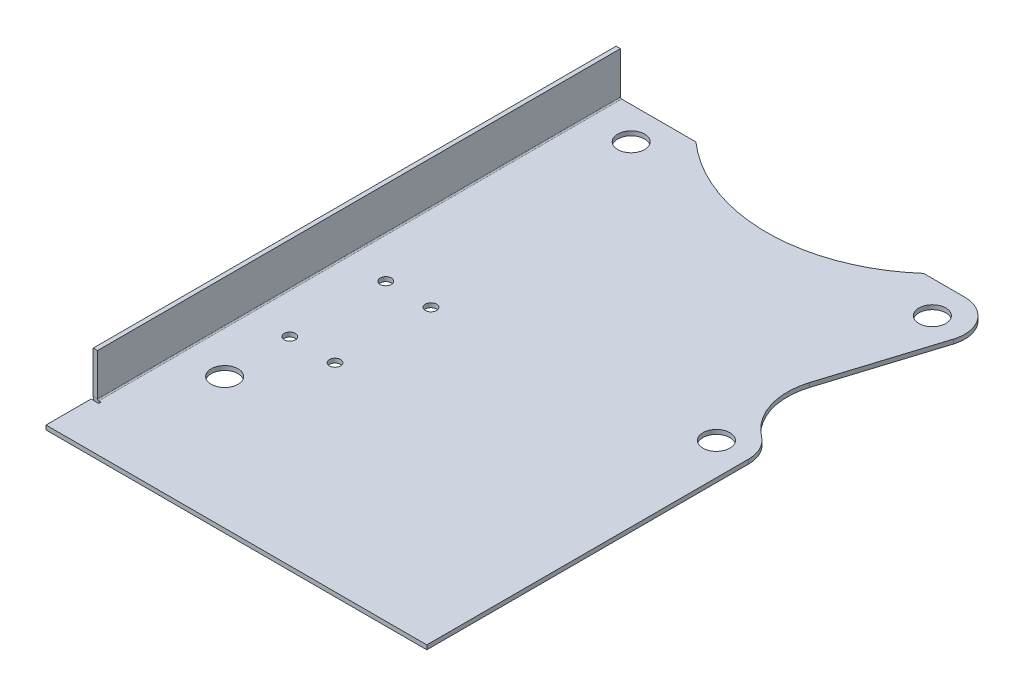
ISO-10303-21;
HEADER;
FILE_DESCRIPTION(('STEP AP214'),'2;1');
FILE_NAME('part.step','',(''),(''),'','','');
FILE_SCHEMA(('AUTOMOTIVE_DESIGN { 1 0 10303 214 1 1 1 1 }'));
ENDSEC;
DATA;
#1=APPLICATION_CONTEXT('core data for automotive mechanical design processes');
#2=APPLICATION_PROTOCOL_DEFINITION('international standard','automotive_design',2000,#1);
#3=PRODUCT_CONTEXT('',#1,'mechanical');
#4=PRODUCT('Part','Part','',(#3));
#5=PRODUCT_RELATED_PRODUCT_CATEGORY('part','',(#4));
#6=PRODUCT_DEFINITION_FORMATION('','',#4);
#7=PRODUCT_DEFINITION_CONTEXT('part definition',#1,'design');
#8=PRODUCT_DEFINITION('design','',#6,#7);
#9=PRODUCT_DEFINITION_SHAPE('','',#8);
#10=(LENGTH_UNIT() NAMED_UNIT(*) SI_UNIT(.MILLI.,.METRE.));
#11=(NAMED_UNIT(*) PLANE_ANGLE_UNIT() SI_UNIT($,.RADIAN.));
#12=(NAMED_UNIT(*) SI_UNIT($,.STERADIAN.) SOLID_ANGLE_UNIT());
#13=UNCERTAINTY_MEASURE_WITH_UNIT(LENGTH_MEASURE(1.E-05),#10,'distance_accuracy_value','');
#14=(GEOMETRIC_REPRESENTATION_CONTEXT(3) GLOBAL_UNCERTAINTY_ASSIGNED_CONTEXT((#13)) GLOBAL_UNIT_ASSIGNED_CONTEXT((#10,
#11,#12)) REPRESENTATION_CONTEXT('',''));
#15=CARTESIAN_POINT('',(0.,0.,0.));
#16=DIRECTION('',(0.,0.,1.));
#17=DIRECTION('',(1.,0.,0.));
#18=AXIS2_PLACEMENT_3D('',#15,#16,#17);
#19=CARTESIAN_POINT('',(-114.3,-2.54,0.));
#20=DIRECTION('',(-1.,0.,0.));
#21=DIRECTION('',(0.,0.,1.));
#22=AXIS2_PLACEMENT_3D('',#19,#20,#21);
#23=PLANE('',#22);
#24=DIRECTION('',(0.,0.,1.));
#25=VECTOR('',#24,1.);
#26=CARTESIAN_POINT('',(-114.3,0.,0.));
#27=LINE('',#26,#25);
#28=CARTESIAN_POINT('',(-114.3,0.,-26.6065000000031));
#29=VERTEX_POINT('',#28);
#30=CARTESIAN_POINT('',(-114.3,0.,0.));
#31=VERTEX_POINT('',#30);
#32=EDGE_CURVE('E203',#29,#31,#27,.T.);
#33=ORIENTED_EDGE('',*,*,#32,.F.);
#34=DIRECTION('',(0.,-1.,0.));
#35=VECTOR('',#34,1.);
#36=CARTESIAN_POINT('',(-114.3,0.,-26.6065000000031));
#37=LINE('',#36,#35);
#38=CARTESIAN_POINT('',(-114.3,-2.54,-26.6065000000031));
#39=VERTEX_POINT('',#38);
#40=EDGE_CURVE('E269',#29,#39,#37,.T.);
#41=ORIENTED_EDGE('',*,*,#40,.T.);
#42=DIRECTION('',(0.,0.,1.));
#43=VECTOR('',#42,1.);
#44=CARTESIAN_POINT('',(-114.3,-2.54,0.));
#45=LINE('',#44,#43);
#46=CARTESIAN_POINT('',(-114.3,-2.54,0.));
#47=VERTEX_POINT('',#46);
#48=EDGE_CURVE('E141',#39,#47,#45,.T.);
#49=ORIENTED_EDGE('',*,*,#48,.T.);
#50=DIRECTION('',(0.,1.,0.));
#51=VECTOR('',#50,1.);
#52=CARTESIAN_POINT('',(-114.3,-2.54,0.));
#53=LINE('',#52,#51);
#54=EDGE_CURVE('E71',#47,#31,#53,.T.);
#55=ORIENTED_EDGE('',*,*,#54,.T.);
#56=EDGE_LOOP('',(#33,#41,#49,#55));
#57=FACE_BOUND('',#56,.T.);
#58=ADVANCED_FACE('F67',(#57),#23,.T.);
#59=CARTESIAN_POINT('',(91.4399999999995,-2.54,-190.003314762674));
#60=DIRECTION('',(0.,1.,0.));
#61=DIRECTION('',(0.,0.,1.));
#62=AXIS2_PLACEMENT_3D('',#59,#60,#61);
#63=PLANE('',#62);
#64=CARTESIAN_POINT('',(-86.3600000000001,-2.54,-317.5));
#65=DIRECTION('',(0.,1.,0.));
#66=DIRECTION('',(0.,0.,1.));
#67=AXIS2_PLACEMENT_3D('',#64,#65,#66);
#68=CIRCLE('',#67,7.93749999999998);
#69=CARTESIAN_POINT('',(-86.3600000000001,-2.54,-309.5625));
#70=VERTEX_POINT('',#69);
#71=EDGE_CURVE('E204',#70,#70,#68,.T.);
#72=ORIENTED_EDGE('',*,*,#71,.T.);
#73=EDGE_LOOP('',(#72));
#74=FACE_BOUND('',#73,.T.);
#75=CARTESIAN_POINT('',(91.4400000000042,-2.54,-317.5));
#76=DIRECTION('',(0.,1.,0.));
#77=DIRECTION('',(0.,0.,1.));
#78=AXIS2_PLACEMENT_3D('',#75,#76,#77);
#79=CIRCLE('',#78,7.93750000000405);
#80=CARTESIAN_POINT('',(91.4400000000042,-2.54,-309.562499999996));
#81=VERTEX_POINT('',#80);
#82=EDGE_CURVE('E347',#81,#81,#79,.T.);
#83=ORIENTED_EDGE('',*,*,#82,.T.);
#84=EDGE_LOOP('',(#83));
#85=FACE_BOUND('',#84,.T.);
#86=CARTESIAN_POINT('',(91.4399999999995,-2.54,-190.003314762674));
#87=DIRECTION('',(0.,1.,0.));
#88=DIRECTION('',(0.,0.,1.));
#89=AXIS2_PLACEMENT_3D('',#86,#87,#88);
#90=CIRCLE('',#89,7.93749999999997);
#91=CARTESIAN_POINT('',(91.4399999999995,-2.54,-182.065814762674));
#92=VERTEX_POINT('',#91);
#93=EDGE_CURVE('E341',#92,#92,#90,.T.);
#94=ORIENTED_EDGE('',*,*,#93,.T.);
#95=EDGE_LOOP('',(#94));
#96=FACE_BOUND('',#95,.T.);
#97=CARTESIAN_POINT('',(-86.3600000000005,-2.54,-77.5033147626737));
#98=DIRECTION('',(0.,1.,0.));
#99=DIRECTION('',(0.,0.,1.));
#100=AXIS2_PLACEMENT_3D('',#97,#98,#99);
#101=CIRCLE('',#100,7.93750000000116);
#102=CARTESIAN_POINT('',(-86.3600000000005,-2.54,-69.5658147626726));
#103=VERTEX_POINT('',#102);
#104=EDGE_CURVE('E333',#103,#103,#101,.T.);
#105=ORIENTED_EDGE('',*,*,#104,.T.);
#106=EDGE_LOOP('',(#105));
#107=FACE_BOUND('',#106,.T.);
#108=CARTESIAN_POINT('',(-60.8584000000001,-2.54,-173.787563646912));
#109=DIRECTION('',(0.,1.,0.));
#110=DIRECTION('',(0.,0.,1.));
#111=AXIS2_PLACEMENT_3D('',#108,#109,#110);
#112=CIRCLE('',#111,3.302);
#113=CARTESIAN_POINT('',(-60.8584000000001,-2.54,-170.485563646912));
#114=VERTEX_POINT('',#113);
#115=EDGE_CURVE('E325',#114,#114,#112,.T.);
#116=ORIENTED_EDGE('',*,*,#115,.T.);
#117=EDGE_LOOP('',(#116));
#118=FACE_BOUND('',#117,.T.);
#119=CARTESIAN_POINT('',(-87.5284000000001,-2.54,-173.787563646912));
#120=DIRECTION('',(0.,1.,0.));
#121=DIRECTION('',(0.,0.,1.));
#122=AXIS2_PLACEMENT_3D('',#119,#120,#121);
#123=CIRCLE('',#122,3.302);
#124=CARTESIAN_POINT('',(-87.5284000000001,-2.54,-170.485563646912));
#125=VERTEX_POINT('',#124);
#126=EDGE_CURVE('E317',#125,#125,#123,.T.);
#127=ORIENTED_EDGE('',*,*,#126,.T.);
#128=EDGE_LOOP('',(#127));
#129=FACE_BOUND('',#128,.T.);
#130=CARTESIAN_POINT('',(-60.8584000000001,-2.54,-117.145563646912));
#131=DIRECTION('',(0.,1.,0.));
#132=DIRECTION('',(0.,0.,1.));
#133=AXIS2_PLACEMENT_3D('',#130,#131,#132);
#134=CIRCLE('',#133,3.30200000000001);
#135=CARTESIAN_POINT('',(-60.8584000000001,-2.54,-113.843563646912));
#136=VERTEX_POINT('',#135);
#137=EDGE_CURVE('E310',#136,#136,#134,.T.);
#138=ORIENTED_EDGE('',*,*,#137,.T.);
#139=EDGE_LOOP('',(#138));
#140=FACE_BOUND('',#139,.T.);
#141=CARTESIAN_POINT('',(-87.5284000000001,-2.54,-117.145563646912));
#142=DIRECTION('',(0.,1.,0.));
#143=DIRECTION('',(0.,0.,1.));
#144=AXIS2_PLACEMENT_3D('',#141,#142,#143);
#145=CIRCLE('',#144,3.302);
#146=CARTESIAN_POINT('',(-87.5284000000001,-2.54,-113.843563646912));
#147=VERTEX_POINT('',#146);
#148=EDGE_CURVE('E302',#147,#147,#145,.T.);
#149=ORIENTED_EDGE('',*,*,#148,.T.);
#150=EDGE_LOOP('',(#149));
#151=FACE_BOUND('',#150,.T.);
#152=DIRECTION('',(-1.,0.,0.));
#153=VECTOR('',#152,1.);
#154=CARTESIAN_POINT('',(91.4399999999993,-2.54,-26.6065000000029));
#155=LINE('',#154,#153);
#156=CARTESIAN_POINT('',(-109.7534,-2.54,-26.6065000000031));
#157=VERTEX_POINT('',#156);
#158=EDGE_CURVE('E297',#157,#39,#155,.T.);
#159=ORIENTED_EDGE('',*,*,#158,.F.);
#160=DIRECTION('',(0.,0.,1.));
#161=VECTOR('',#160,1.);
#162=CARTESIAN_POINT('',(-109.7534,-2.54,-190.003314762674));
#163=LINE('',#162,#161);
#164=CARTESIAN_POINT('',(-109.7534,-2.54,-27.8765000000031));
#165=VERTEX_POINT('',#164);
#166=EDGE_CURVE('E275',#165,#157,#163,.T.);
#167=ORIENTED_EDGE('',*,*,#166,.F.);
#168=DIRECTION('',(1.,0.,0.));
#169=VECTOR('',#168,1.);
#170=CARTESIAN_POINT('',(91.4399999999995,-2.54,-27.8765000000031));
#171=LINE('',#170,#169);
#172=CARTESIAN_POINT('',(-111.0234,-2.54,-27.8765000000031));
#173=VERTEX_POINT('',#172);
#174=EDGE_CURVE('E268',#173,#165,#171,.T.);
#175=ORIENTED_EDGE('',*,*,#174,.F.);
#176=DIRECTION('',(0.,0.,1.));
#177=VECTOR('',#176,1.);
#178=CARTESIAN_POINT('',(-111.0234,-2.54,-27.8765000000031));
#179=LINE('',#178,#177);
#180=CARTESIAN_POINT('',(-111.0234,-2.54,-336.55));
#181=VERTEX_POINT('',#180);
#182=EDGE_CURVE('E441',#173,#181,#179,.F.);
#183=ORIENTED_EDGE('',*,*,#182,.T.);
#184=DIRECTION('',(-1.,0.,0.));
#185=VECTOR('',#184,1.);
#186=CARTESIAN_POINT('',(-67.2020833010406,-2.54,-336.55));
#187=LINE('',#186,#185);
#188=CARTESIAN_POINT('',(-67.2020833010406,-2.54,-336.55));
#189=VERTEX_POINT('',#188);
#190=EDGE_CURVE('E232',#189,#181,#187,.T.);
#191=ORIENTED_EDGE('',*,*,#190,.F.);
#192=CARTESIAN_POINT('',(0.,-2.54,-412.75));
#193=DIRECTION('',(0.,-1.,0.));
#194=DIRECTION('',(0.,0.,1.));
#195=AXIS2_PLACEMENT_3D('',#192,#193,#194);
#196=CIRCLE('',#195,101.6);
#197=CARTESIAN_POINT('',(67.2020833010406,-2.54,-336.55));
#198=VERTEX_POINT('',#197);
#199=EDGE_CURVE('E186',#198,#189,#196,.T.);
#200=ORIENTED_EDGE('',*,*,#199,.F.);
#201=DIRECTION('',(-1.,0.,0.));
#202=VECTOR('',#201,1.);
#203=CARTESIAN_POINT('',(91.4400000000042,-2.54,-336.55));
#204=LINE('',#203,#202);
#205=CARTESIAN_POINT('',(91.4400000000042,-2.54,-336.55));
#206=VERTEX_POINT('',#205);
#207=EDGE_CURVE('E168',#206,#198,#204,.T.);
#208=ORIENTED_EDGE('',*,*,#207,.F.);
#209=CARTESIAN_POINT('',(91.4400000000042,-2.54,-317.5));
#210=DIRECTION('',(0.,1.,0.));
#211=DIRECTION('',(0.,0.,1.));
#212=AXIS2_PLACEMENT_3D('',#209,#210,#211);
#213=CIRCLE('',#212,19.05);
#214=CARTESIAN_POINT('',(109.619528435834,-2.54,-311.807263764159));
#215=VERTEX_POINT('',#214);
#216=EDGE_CURVE('E184',#215,#206,#213,.T.);
#217=ORIENTED_EDGE('',*,*,#216,.F.);
#218=DIRECTION('',(0.298831298469321,0.,-0.95430595463674));
#219=VECTOR('',#218,1.);
#220=CARTESIAN_POINT('',(109.619528435834,-2.54,-311.807263764159));
#221=LINE('',#220,#219);
#222=CARTESIAN_POINT('',(89.3619611476466,-2.54,-247.11552234151));
#223=VERTEX_POINT('',#222);
#224=EDGE_CURVE('E191',#223,#215,#221,.T.);
#225=ORIENTED_EDGE('',*,*,#224,.F.);
#226=CARTESIAN_POINT('',(125.721018019306,-2.54,-235.730049869829));
#227=DIRECTION('',(0.,-1.,0.));
#228=DIRECTION('',(0.,0.,1.));
#229=AXIS2_PLACEMENT_3D('',#226,#227,#228);
#230=CIRCLE('',#229,38.1);
#231=CARTESIAN_POINT('',(102.867006006435,-2.54,-205.245559798392));
#232=VERTEX_POINT('',#231);
#233=EDGE_CURVE('E194',#232,#223,#230,.T.);
#234=ORIENTED_EDGE('',*,*,#233,.F.);
#235=CARTESIAN_POINT('',(91.4399999999995,-2.54,-190.003314762674));
#236=DIRECTION('',(0.,1.,0.));
#237=DIRECTION('',(0.,0.,1.));
#238=AXIS2_PLACEMENT_3D('',#235,#236,#237);
#239=CIRCLE('',#238,19.05);
#240=CARTESIAN_POINT('',(110.489999999999,-2.54,-190.003314762674));
#241=VERTEX_POINT('',#240);
#242=EDGE_CURVE('E369',#241,#232,#239,.T.);
#243=ORIENTED_EDGE('',*,*,#242,.F.);
#244=DIRECTION('',(0.,0.,-1.));
#245=VECTOR('',#244,1.);
#246=CARTESIAN_POINT('',(110.489999999999,-2.54,-190.003314762674));
#247=LINE('',#246,#245);
#248=CARTESIAN_POINT('',(110.49,-2.54,0.));
#249=VERTEX_POINT('',#248);
#250=EDGE_CURVE('E365',#249,#241,#247,.T.);
#251=ORIENTED_EDGE('',*,*,#250,.F.);
#252=DIRECTION('',(1.,0.,0.));
#253=VECTOR('',#252,1.);
#254=CARTESIAN_POINT('',(110.49,-2.54,0.));
#255=LINE('',#254,#253);
#256=EDGE_CURVE('E362',#47,#249,#255,.T.);
#257=ORIENTED_EDGE('',*,*,#256,.F.);
#258=ORIENTED_EDGE('',*,*,#48,.F.);
#259=EDGE_LOOP('',(#159,#167,#175,#183,#191,#200,#208,#217,#225,#234,#243,#251,#257,#258));
#260=FACE_BOUND('',#259,.T.);
#261=ADVANCED_FACE('F182',(#74,#85,#96,#107,#118,#129,#140,#151,#260),#63,.F.);
#262=CARTESIAN_POINT('',(91.4399999999995,0.,-190.003314762674));
#263=DIRECTION('',(0.,1.,0.));
#264=DIRECTION('',(0.,0.,1.));
#265=AXIS2_PLACEMENT_3D('',#262,#263,#264);
#266=PLANE('',#265);
#267=CARTESIAN_POINT('',(-87.5284000000001,0.,-117.145563646912));
#268=DIRECTION('',(0.,1.,0.));
#269=DIRECTION('',(0.,0.,1.));
#270=AXIS2_PLACEMENT_3D('',#267,#268,#269);
#271=CIRCLE('',#270,3.302);
#272=CARTESIAN_POINT('',(-87.5284000000001,0.,-113.843563646912));
#273=VERTEX_POINT('',#272);
#274=EDGE_CURVE('E301',#273,#273,#271,.T.);
#275=ORIENTED_EDGE('',*,*,#274,.F.);
#276=EDGE_LOOP('',(#275));
#277=FACE_BOUND('',#276,.T.);
#278=CARTESIAN_POINT('',(-60.8584000000001,0.,-117.145563646912));
#279=DIRECTION('',(0.,1.,0.));
#280=DIRECTION('',(0.,0.,1.));
#281=AXIS2_PLACEMENT_3D('',#278,#279,#280);
#282=CIRCLE('',#281,3.30200000000001);
#283=CARTESIAN_POINT('',(-60.8584000000001,0.,-113.843563646912));
#284=VERTEX_POINT('',#283);
#285=EDGE_CURVE('E306',#284,#284,#282,.T.);
#286=ORIENTED_EDGE('',*,*,#285,.F.);
#287=EDGE_LOOP('',(#286));
#288=FACE_BOUND('',#287,.T.);
#289=CARTESIAN_POINT('',(-87.5284000000001,0.,-173.787563646912));
#290=DIRECTION('',(0.,1.,0.));
#291=DIRECTION('',(0.,0.,1.));
#292=AXIS2_PLACEMENT_3D('',#289,#290,#291);
#293=CIRCLE('',#292,3.302);
#294=CARTESIAN_POINT('',(-87.5284000000001,0.,-170.485563646912));
#295=VERTEX_POINT('',#294);
#296=EDGE_CURVE('E314',#295,#295,#293,.T.);
#297=ORIENTED_EDGE('',*,*,#296,.F.);
#298=EDGE_LOOP('',(#297));
#299=FACE_BOUND('',#298,.T.);
#300=CARTESIAN_POINT('',(-60.8584000000001,0.,-173.787563646912));
#301=DIRECTION('',(0.,1.,0.));
#302=DIRECTION('',(0.,0.,1.));
#303=AXIS2_PLACEMENT_3D('',#300,#301,#302);
#304=CIRCLE('',#303,3.302);
#305=CARTESIAN_POINT('',(-60.8584000000001,0.,-170.485563646912));
#306=VERTEX_POINT('',#305);
#307=EDGE_CURVE('E321',#306,#306,#304,.T.);
#308=ORIENTED_EDGE('',*,*,#307,.F.);
#309=EDGE_LOOP('',(#308));
#310=FACE_BOUND('',#309,.T.);
#311=CARTESIAN_POINT('',(-86.3600000000005,0.,-77.5033147626737));
#312=DIRECTION('',(0.,1.,0.));
#313=DIRECTION('',(0.,0.,1.));
#314=AXIS2_PLACEMENT_3D('',#311,#312,#313);
#315=CIRCLE('',#314,7.93750000000116);
#316=CARTESIAN_POINT('',(-86.3600000000005,0.,-69.5658147626726));
#317=VERTEX_POINT('',#316);
#318=EDGE_CURVE('E329',#317,#317,#315,.T.);
#319=ORIENTED_EDGE('',*,*,#318,.F.);
#320=EDGE_LOOP('',(#319));
#321=FACE_BOUND('',#320,.T.);
#322=CARTESIAN_POINT('',(91.4399999999995,0.,-190.003314762674));
#323=DIRECTION('',(0.,1.,0.));
#324=DIRECTION('',(0.,0.,1.));
#325=AXIS2_PLACEMENT_3D('',#322,#323,#324);
#326=CIRCLE('',#325,7.93749999999997);
#327=CARTESIAN_POINT('',(91.4399999999995,0.,-182.065814762674));
#328=VERTEX_POINT('',#327);
#329=EDGE_CURVE('E337',#328,#328,#326,.T.);
#330=ORIENTED_EDGE('',*,*,#329,.F.);
#331=EDGE_LOOP('',(#330));
#332=FACE_BOUND('',#331,.T.);
#333=CARTESIAN_POINT('',(91.4400000000042,0.,-317.5));
#334=DIRECTION('',(0.,1.,0.));
#335=DIRECTION('',(0.,0.,1.));
#336=AXIS2_PLACEMENT_3D('',#333,#334,#335);
#337=CIRCLE('',#336,7.93750000000405);
#338=CARTESIAN_POINT('',(91.4400000000042,0.,-309.562499999996));
#339=VERTEX_POINT('',#338);
#340=EDGE_CURVE('E344',#339,#339,#337,.T.);
#341=ORIENTED_EDGE('',*,*,#340,.F.);
#342=EDGE_LOOP('',(#341));
#343=FACE_BOUND('',#342,.T.);
#344=CARTESIAN_POINT('',(-86.3600000000001,0.,-317.5));
#345=DIRECTION('',(0.,1.,0.));
#346=DIRECTION('',(0.,0.,1.));
#347=AXIS2_PLACEMENT_3D('',#344,#345,#346);
#348=CIRCLE('',#347,7.93749999999998);
#349=CARTESIAN_POINT('',(-86.3600000000001,0.,-309.5625));
#350=VERTEX_POINT('',#349);
#351=EDGE_CURVE('E351',#350,#350,#348,.T.);
#352=ORIENTED_EDGE('',*,*,#351,.F.);
#353=EDGE_LOOP('',(#352));
#354=FACE_BOUND('',#353,.T.);
#355=DIRECTION('',(0.,0.,-1.));
#356=VECTOR('',#355,1.);
#357=CARTESIAN_POINT('',(-109.7534,0.,-26.6065000000031));
#358=LINE('',#357,#356);
#359=CARTESIAN_POINT('',(-109.7534,0.,-26.6065000000031));
#360=VERTEX_POINT('',#359);
#361=CARTESIAN_POINT('',(-109.7534,0.,-27.8765000000031));
#362=VERTEX_POINT('',#361);
#363=EDGE_CURVE('E260',#360,#362,#358,.T.);
#364=ORIENTED_EDGE('',*,*,#363,.F.);
#365=DIRECTION('',(1.,0.,0.));
#366=VECTOR('',#365,1.);
#367=CARTESIAN_POINT('',(-114.3,0.,-26.6065000000031));
#368=LINE('',#367,#366);
#369=EDGE_CURVE('E257',#29,#360,#368,.T.);
#370=ORIENTED_EDGE('',*,*,#369,.F.);
#371=ORIENTED_EDGE('',*,*,#32,.T.);
#372=DIRECTION('',(1.,0.,0.));
#373=VECTOR('',#372,1.);
#374=CARTESIAN_POINT('',(110.49,0.,0.));
#375=LINE('',#374,#373);
#376=CARTESIAN_POINT('',(110.49,0.,0.));
#377=VERTEX_POINT('',#376);
#378=EDGE_CURVE('E207',#31,#377,#375,.T.);
#379=ORIENTED_EDGE('',*,*,#378,.T.);
#380=DIRECTION('',(0.,0.,-1.));
#381=VECTOR('',#380,1.);
#382=CARTESIAN_POINT('',(110.489999999999,0.,-190.003314762674));
#383=LINE('',#382,#381);
#384=CARTESIAN_POINT('',(110.489999999999,0.,-190.003314762674));
#385=VERTEX_POINT('',#384);
#386=EDGE_CURVE('E211',#377,#385,#383,.T.);
#387=ORIENTED_EDGE('',*,*,#386,.T.);
#388=CARTESIAN_POINT('',(91.4399999999995,0.,-190.003314762674));
#389=DIRECTION('',(0.,1.,0.));
#390=DIRECTION('',(0.,0.,1.));
#391=AXIS2_PLACEMENT_3D('',#388,#389,#390);
#392=CIRCLE('',#391,19.05);
#393=CARTESIAN_POINT('',(102.867006006435,0.,-205.245559798392));
#394=VERTEX_POINT('',#393);
#395=EDGE_CURVE('E215',#385,#394,#392,.T.);
#396=ORIENTED_EDGE('',*,*,#395,.T.);
#397=CARTESIAN_POINT('',(125.721018019306,0.,-235.730049869829));
#398=DIRECTION('',(0.,-1.,0.));
#399=DIRECTION('',(0.,0.,1.));
#400=AXIS2_PLACEMENT_3D('',#397,#398,#399);
#401=CIRCLE('',#400,38.1);
#402=CARTESIAN_POINT('',(89.3619611476466,0.,-247.11552234151));
#403=VERTEX_POINT('',#402);
#404=EDGE_CURVE('E218',#394,#403,#401,.T.);
#405=ORIENTED_EDGE('',*,*,#404,.T.);
#406=DIRECTION('',(0.298831298469321,0.,-0.95430595463674));
#407=VECTOR('',#406,1.);
#408=CARTESIAN_POINT('',(109.619528435834,0.,-311.807263764159));
#409=LINE('',#408,#407);
#410=CARTESIAN_POINT('',(109.619528435834,0.,-311.807263764159));
#411=VERTEX_POINT('',#410);
#412=EDGE_CURVE('E221',#403,#411,#409,.T.);
#413=ORIENTED_EDGE('',*,*,#412,.T.);
#414=CARTESIAN_POINT('',(91.4400000000042,0.,-317.5));
#415=DIRECTION('',(0.,1.,0.));
#416=DIRECTION('',(0.,0.,1.));
#417=AXIS2_PLACEMENT_3D('',#414,#415,#416);
#418=CIRCLE('',#417,19.05);
#419=CARTESIAN_POINT('',(91.4400000000042,0.,-336.55));
#420=VERTEX_POINT('',#419);
#421=EDGE_CURVE('E224',#411,#420,#418,.T.);
#422=ORIENTED_EDGE('',*,*,#421,.T.);
#423=DIRECTION('',(-1.,0.,0.));
#424=VECTOR('',#423,1.);
#425=CARTESIAN_POINT('',(91.4400000000042,0.,-336.55));
#426=LINE('',#425,#424);
#427=CARTESIAN_POINT('',(67.2020833010406,0.,-336.55));
#428=VERTEX_POINT('',#427);
#429=EDGE_CURVE('E171',#420,#428,#426,.T.);
#430=ORIENTED_EDGE('',*,*,#429,.T.);
#431=CARTESIAN_POINT('',(0.,0.,-412.75));
#432=DIRECTION('',(0.,-1.,0.));
#433=DIRECTION('',(0.,0.,1.));
#434=AXIS2_PLACEMENT_3D('',#431,#432,#433);
#435=CIRCLE('',#434,101.6);
#436=CARTESIAN_POINT('',(-67.2020833010406,0.,-336.55));
#437=VERTEX_POINT('',#436);
#438=EDGE_CURVE('E229',#428,#437,#435,.T.);
#439=ORIENTED_EDGE('',*,*,#438,.T.);
#440=DIRECTION('',(-1.,0.,0.));
#441=VECTOR('',#440,1.);
#442=CARTESIAN_POINT('',(-67.2020833010406,0.,-336.55));
#443=LINE('',#442,#441);
#444=CARTESIAN_POINT('',(-111.0234,0.,-336.55));
#445=VERTEX_POINT('',#444);
#446=EDGE_CURVE('E200',#437,#445,#443,.T.);
#447=ORIENTED_EDGE('',*,*,#446,.T.);
#448=DIRECTION('',(0.,0.,1.));
#449=VECTOR('',#448,1.);
#450=CARTESIAN_POINT('',(-111.0234,0.,-27.8765000000031));
#451=LINE('',#450,#449);
#452=CARTESIAN_POINT('',(-111.0234,0.,-27.8765000000031));
#453=VERTEX_POINT('',#452);
#454=EDGE_CURVE('E503',#453,#445,#451,.F.);
#455=ORIENTED_EDGE('',*,*,#454,.F.);
#456=DIRECTION('',(-1.,0.,0.));
#457=VECTOR('',#456,1.);
#458=CARTESIAN_POINT('',(-109.7534,0.,-27.8765000000031));
#459=LINE('',#458,#457);
#460=EDGE_CURVE('E87',#362,#453,#459,.T.);
#461=ORIENTED_EDGE('',*,*,#460,.F.);
#462=EDGE_LOOP('',(#364,#370,#371,#379,#387,#396,#405,#413,#422,#430,#439,#447,#455,#461));
#463=FACE_BOUND('',#462,.T.);
#464=ADVANCED_FACE('F254',(#277,#288,#299,#310,#321,#332,#343,#354,#463),#266,.T.);
#465=CARTESIAN_POINT('',(-67.2020833010406,-2.54,-336.55));
#466=DIRECTION('',(0.,0.,-1.));
#467=DIRECTION('',(-1.,0.,0.));
#468=AXIS2_PLACEMENT_3D('',#465,#466,#467);
#469=PLANE('',#468);
#470=DIRECTION('',(0.,-1.,0.));
#471=VECTOR('',#470,1.);
#472=CARTESIAN_POINT('',(-111.0234,0.,-336.55));
#473=LINE('',#472,#471);
#474=EDGE_CURVE('E291',#445,#181,#473,.T.);
#475=ORIENTED_EDGE('',*,*,#474,.F.);
#476=ORIENTED_EDGE('',*,*,#446,.F.);
#477=DIRECTION('',(0.,1.,0.));
#478=VECTOR('',#477,1.);
#479=CARTESIAN_POINT('',(-67.2020833010406,-2.54,-336.55));
#480=LINE('',#479,#478);
#481=EDGE_CURVE('E13',#189,#437,#480,.T.);
#482=ORIENTED_EDGE('',*,*,#481,.F.);
#483=ORIENTED_EDGE('',*,*,#190,.T.);
#484=EDGE_LOOP('',(#475,#476,#482,#483));
#485=FACE_BOUND('',#484,.T.);
#486=ADVANCED_FACE('F69',(#485),#469,.T.);
#487=CARTESIAN_POINT('',(0.,-2.54,-412.75));
#488=DIRECTION('',(0.,1.,0.));
#489=DIRECTION('',(0.,0.,1.));
#490=AXIS2_PLACEMENT_3D('',#487,#488,#489);
#491=CYLINDRICAL_SURFACE('',#490,101.6);
#492=ORIENTED_EDGE('',*,*,#438,.F.);
#493=DIRECTION('',(0.,1.,0.));
#494=VECTOR('',#493,1.);
#495=CARTESIAN_POINT('',(67.2020833010406,-2.54,-336.55));
#496=LINE('',#495,#494);
#497=EDGE_CURVE('E76',#198,#428,#496,.T.);
#498=ORIENTED_EDGE('',*,*,#497,.F.);
#499=ORIENTED_EDGE('',*,*,#199,.T.);
#500=ORIENTED_EDGE('',*,*,#481,.T.);
#501=EDGE_LOOP('',(#492,#498,#499,#500));
#502=FACE_BOUND('',#501,.T.);
#503=ADVANCED_FACE('F557',(#502),#491,.F.);
#504=CARTESIAN_POINT('',(91.4400000000042,-2.54,-336.55));
#505=DIRECTION('',(0.,0.,-1.));
#506=DIRECTION('',(-1.,0.,0.));
#507=AXIS2_PLACEMENT_3D('',#504,#505,#506);
#508=PLANE('',#507);
#509=ORIENTED_EDGE('',*,*,#429,.F.);
#510=DIRECTION('',(0.,1.,0.));
#511=VECTOR('',#510,1.);
#512=CARTESIAN_POINT('',(91.4400000000042,-2.54,-336.55));
#513=LINE('',#512,#511);
#514=EDGE_CURVE('E165',#206,#420,#513,.T.);
#515=ORIENTED_EDGE('',*,*,#514,.F.);
#516=ORIENTED_EDGE('',*,*,#207,.T.);
#517=ORIENTED_EDGE('',*,*,#497,.T.);
#518=EDGE_LOOP('',(#509,#515,#516,#517));
#519=FACE_BOUND('',#518,.T.);
#520=ADVANCED_FACE('F167',(#519),#508,.T.);
#521=CARTESIAN_POINT('',(91.4400000000042,-2.54,-317.5));
#522=DIRECTION('',(0.,1.,0.));
#523=DIRECTION('',(0.,0.,1.));
#524=AXIS2_PLACEMENT_3D('',#521,#522,#523);
#525=CYLINDRICAL_SURFACE('',#524,19.05);
#526=ORIENTED_EDGE('',*,*,#421,.F.);
#527=DIRECTION('',(0.,1.,0.));
#528=VECTOR('',#527,1.);
#529=CARTESIAN_POINT('',(109.619528435834,-2.54,-311.807263764159));
#530=LINE('',#529,#528);
#531=EDGE_CURVE('E177',#215,#411,#530,.T.);
#532=ORIENTED_EDGE('',*,*,#531,.F.);
#533=ORIENTED_EDGE('',*,*,#216,.T.);
#534=ORIENTED_EDGE('',*,*,#514,.T.);
#535=EDGE_LOOP('',(#526,#532,#533,#534));
#536=FACE_BOUND('',#535,.T.);
#537=ADVANCED_FACE('F189',(#536),#525,.T.);
#538=CARTESIAN_POINT('',(109.619528435834,-2.54,-311.807263764159));
#539=DIRECTION('',(0.95430595463674,0.,0.298831298469321));
#540=DIRECTION('',(0.298831298469321,0.,-0.95430595463674));
#541=AXIS2_PLACEMENT_3D('',#538,#539,#540);
#542=PLANE('',#541);
#543=ORIENTED_EDGE('',*,*,#412,.F.);
#544=DIRECTION('',(0.,1.,0.));
#545=VECTOR('',#544,1.);
#546=CARTESIAN_POINT('',(89.3619611476466,-2.54,-247.11552234151));
#547=LINE('',#546,#545);
#548=EDGE_CURVE('E236',#223,#403,#547,.T.);
#549=ORIENTED_EDGE('',*,*,#548,.F.);
#550=ORIENTED_EDGE('',*,*,#224,.T.);
#551=ORIENTED_EDGE('',*,*,#531,.T.);
#552=EDGE_LOOP('',(#543,#549,#550,#551));
#553=FACE_BOUND('',#552,.T.);
#554=ADVANCED_FACE('F549',(#553),#542,.T.);
#555=CARTESIAN_POINT('',(125.721018019306,-2.54,-235.730049869829));
#556=DIRECTION('',(0.,1.,0.));
#557=DIRECTION('',(0.,0.,1.));
#558=AXIS2_PLACEMENT_3D('',#555,#556,#557);
#559=CYLINDRICAL_SURFACE('',#558,38.1);
#560=ORIENTED_EDGE('',*,*,#404,.F.);
#561=DIRECTION('',(0.,1.,0.));
#562=VECTOR('',#561,1.);
#563=CARTESIAN_POINT('',(102.867006006435,-2.54,-205.245559798392));
#564=LINE('',#563,#562);
#565=EDGE_CURVE('E238',#232,#394,#564,.T.);
#566=ORIENTED_EDGE('',*,*,#565,.F.);
#567=ORIENTED_EDGE('',*,*,#233,.T.);
#568=ORIENTED_EDGE('',*,*,#548,.T.);
#569=EDGE_LOOP('',(#560,#566,#567,#568));
#570=FACE_BOUND('',#569,.T.);
#571=ADVANCED_FACE('F375',(#570),#559,.F.);
#572=CARTESIAN_POINT('',(91.4399999999995,-2.54,-190.003314762674));
#573=DIRECTION('',(0.,1.,0.));
#574=DIRECTION('',(0.,0.,1.));
#575=AXIS2_PLACEMENT_3D('',#572,#573,#574);
#576=CYLINDRICAL_SURFACE('',#575,19.05);
#577=ORIENTED_EDGE('',*,*,#395,.F.);
#578=DIRECTION('',(0.,1.,0.));
#579=VECTOR('',#578,1.);
#580=CARTESIAN_POINT('',(110.489999999999,-2.54,-190.003314762674));
#581=LINE('',#580,#579);
#582=EDGE_CURVE('E240',#241,#385,#581,.T.);
#583=ORIENTED_EDGE('',*,*,#582,.F.);
#584=ORIENTED_EDGE('',*,*,#242,.T.);
#585=ORIENTED_EDGE('',*,*,#565,.T.);
#586=EDGE_LOOP('',(#577,#583,#584,#585));
#587=FACE_BOUND('',#586,.T.);
#588=ADVANCED_FACE('F381',(#587),#576,.T.);
#589=CARTESIAN_POINT('',(110.489999999999,-2.54,-190.003314762674));
#590=DIRECTION('',(1.,0.,0.));
#591=DIRECTION('',(0.,0.,-1.));
#592=AXIS2_PLACEMENT_3D('',#589,#590,#591);
#593=PLANE('',#592);
#594=ORIENTED_EDGE('',*,*,#386,.F.);
#595=DIRECTION('',(0.,1.,0.));
#596=VECTOR('',#595,1.);
#597=CARTESIAN_POINT('',(110.49,-2.54,0.));
#598=LINE('',#597,#596);
#599=EDGE_CURVE('E241',#249,#377,#598,.T.);
#600=ORIENTED_EDGE('',*,*,#599,.F.);
#601=ORIENTED_EDGE('',*,*,#250,.T.);
#602=ORIENTED_EDGE('',*,*,#582,.T.);
#603=EDGE_LOOP('',(#594,#600,#601,#602));
#604=FACE_BOUND('',#603,.T.);
#605=ADVANCED_FACE('F383',(#604),#593,.T.);
#606=CARTESIAN_POINT('',(110.49,-2.54,0.));
#607=DIRECTION('',(0.,0.,1.));
#608=DIRECTION('',(1.,0.,0.));
#609=AXIS2_PLACEMENT_3D('',#606,#607,#608);
#610=PLANE('',#609);
#611=ORIENTED_EDGE('',*,*,#378,.F.);
#612=ORIENTED_EDGE('',*,*,#54,.F.);
#613=ORIENTED_EDGE('',*,*,#256,.T.);
#614=ORIENTED_EDGE('',*,*,#599,.T.);
#615=EDGE_LOOP('',(#611,#612,#613,#614));
#616=FACE_BOUND('',#615,.T.);
#617=ADVANCED_FACE('F251',(#616),#610,.T.);
#618=CARTESIAN_POINT('',(-86.3600000000001,-2.54,-317.5));
#619=DIRECTION('',(0.,1.,0.));
#620=DIRECTION('',(0.,0.,1.));
#621=AXIS2_PLACEMENT_3D('',#618,#619,#620);
#622=CYLINDRICAL_SURFACE('',#621,7.93749999999998);
#623=ORIENTED_EDGE('',*,*,#71,.F.);
#624=EDGE_LOOP('',(#623));
#625=FACE_BOUND('',#624,.T.);
#626=ORIENTED_EDGE('',*,*,#351,.T.);
#627=EDGE_LOOP('',(#626));
#628=FACE_BOUND('',#627,.T.);
#629=ADVANCED_FACE('F542',(#625,#628),#622,.F.);
#630=CARTESIAN_POINT('',(91.4400000000042,-2.54,-317.5));
#631=DIRECTION('',(0.,1.,0.));
#632=DIRECTION('',(0.,0.,1.));
#633=AXIS2_PLACEMENT_3D('',#630,#631,#632);
#634=CYLINDRICAL_SURFACE('',#633,7.93750000000405);
#635=ORIENTED_EDGE('',*,*,#82,.F.);
#636=EDGE_LOOP('',(#635));
#637=FACE_BOUND('',#636,.T.);
#638=ORIENTED_EDGE('',*,*,#340,.T.);
#639=EDGE_LOOP('',(#638));
#640=FACE_BOUND('',#639,.T.);
#641=ADVANCED_FACE('F565',(#637,#640),#634,.F.);
#642=CARTESIAN_POINT('',(91.4399999999995,-2.54,-190.003314762674));
#643=DIRECTION('',(0.,1.,0.));
#644=DIRECTION('',(0.,0.,1.));
#645=AXIS2_PLACEMENT_3D('',#642,#643,#644);
#646=CYLINDRICAL_SURFACE('',#645,7.93749999999997);
#647=ORIENTED_EDGE('',*,*,#93,.F.);
#648=EDGE_LOOP('',(#647));
#649=FACE_BOUND('',#648,.T.);
#650=ORIENTED_EDGE('',*,*,#329,.T.);
#651=EDGE_LOOP('',(#650));
#652=FACE_BOUND('',#651,.T.);
#653=ADVANCED_FACE('F569',(#649,#652),#646,.F.);
#654=CARTESIAN_POINT('',(-86.3600000000005,-2.54,-77.5033147626737));
#655=DIRECTION('',(0.,1.,0.));
#656=DIRECTION('',(0.,0.,1.));
#657=AXIS2_PLACEMENT_3D('',#654,#655,#656);
#658=CYLINDRICAL_SURFACE('',#657,7.93750000000116);
#659=ORIENTED_EDGE('',*,*,#104,.F.);
#660=EDGE_LOOP('',(#659));
#661=FACE_BOUND('',#660,.T.);
#662=ORIENTED_EDGE('',*,*,#318,.T.);
#663=EDGE_LOOP('',(#662));
#664=FACE_BOUND('',#663,.T.);
#665=ADVANCED_FACE('F573',(#661,#664),#658,.F.);
#666=CARTESIAN_POINT('',(-60.8584000000001,-2.54,-173.787563646912));
#667=DIRECTION('',(0.,1.,0.));
#668=DIRECTION('',(0.,0.,1.));
#669=AXIS2_PLACEMENT_3D('',#666,#667,#668);
#670=CYLINDRICAL_SURFACE('',#669,3.302);
#671=ORIENTED_EDGE('',*,*,#115,.F.);
#672=EDGE_LOOP('',(#671));
#673=FACE_BOUND('',#672,.T.);
#674=ORIENTED_EDGE('',*,*,#307,.T.);
#675=EDGE_LOOP('',(#674));
#676=FACE_BOUND('',#675,.T.);
#677=ADVANCED_FACE('F577',(#673,#676),#670,.F.);
#678=CARTESIAN_POINT('',(-87.5284000000001,-2.54,-173.787563646912));
#679=DIRECTION('',(0.,1.,0.));
#680=DIRECTION('',(0.,0.,1.));
#681=AXIS2_PLACEMENT_3D('',#678,#679,#680);
#682=CYLINDRICAL_SURFACE('',#681,3.302);
#683=ORIENTED_EDGE('',*,*,#126,.F.);
#684=EDGE_LOOP('',(#683));
#685=FACE_BOUND('',#684,.T.);
#686=ORIENTED_EDGE('',*,*,#296,.T.);
#687=EDGE_LOOP('',(#686));
#688=FACE_BOUND('',#687,.T.);
#689=ADVANCED_FACE('F581',(#685,#688),#682,.F.);
#690=CARTESIAN_POINT('',(-60.8584000000001,-2.54,-117.145563646912));
#691=DIRECTION('',(0.,1.,0.));
#692=DIRECTION('',(0.,0.,1.));
#693=AXIS2_PLACEMENT_3D('',#690,#691,#692);
#694=CYLINDRICAL_SURFACE('',#693,3.30200000000001);
#695=ORIENTED_EDGE('',*,*,#137,.F.);
#696=EDGE_LOOP('',(#695));
#697=FACE_BOUND('',#696,.T.);
#698=ORIENTED_EDGE('',*,*,#285,.T.);
#699=EDGE_LOOP('',(#698));
#700=FACE_BOUND('',#699,.T.);
#701=ADVANCED_FACE('F585',(#697,#700),#694,.F.);
#702=CARTESIAN_POINT('',(-87.5284000000001,-2.54,-117.145563646912));
#703=DIRECTION('',(0.,1.,0.));
#704=DIRECTION('',(0.,0.,1.));
#705=AXIS2_PLACEMENT_3D('',#702,#703,#704);
#706=CYLINDRICAL_SURFACE('',#705,3.302);
#707=ORIENTED_EDGE('',*,*,#148,.F.);
#708=EDGE_LOOP('',(#707));
#709=FACE_BOUND('',#708,.T.);
#710=ORIENTED_EDGE('',*,*,#274,.T.);
#711=EDGE_LOOP('',(#710));
#712=FACE_BOUND('',#711,.T.);
#713=ADVANCED_FACE('F589',(#709,#712),#706,.F.);
#714=CARTESIAN_POINT('',(-114.3,0.,-26.6065000000031));
#715=DIRECTION('',(0.,0.,-1.));
#716=DIRECTION('',(-1.,0.,0.));
#717=AXIS2_PLACEMENT_3D('',#714,#715,#716);
#718=PLANE('',#717);
#719=DIRECTION('',(0.,-1.,0.));
#720=VECTOR('',#719,1.);
#721=CARTESIAN_POINT('',(-109.7534,0.,-26.6065000000031));
#722=LINE('',#721,#720);
#723=EDGE_CURVE('E284',#360,#157,#722,.T.);
#724=ORIENTED_EDGE('',*,*,#723,.T.);
#725=ORIENTED_EDGE('',*,*,#158,.T.);
#726=ORIENTED_EDGE('',*,*,#40,.F.);
#727=ORIENTED_EDGE('',*,*,#369,.T.);
#728=EDGE_LOOP('',(#724,#725,#726,#727));
#729=FACE_BOUND('',#728,.T.);
#730=ADVANCED_FACE('F593',(#729),#718,.T.);
#731=CARTESIAN_POINT('',(-109.7534,0.,-26.6065000000031));
#732=DIRECTION('',(-1.,0.,0.));
#733=DIRECTION('',(0.,0.,1.));
#734=AXIS2_PLACEMENT_3D('',#731,#732,#733);
#735=PLANE('',#734);
#736=DIRECTION('',(0.,-1.,0.));
#737=VECTOR('',#736,1.);
#738=CARTESIAN_POINT('',(-109.7534,0.,-27.8765000000031));
#739=LINE('',#738,#737);
#740=EDGE_CURVE('E287',#362,#165,#739,.T.);
#741=ORIENTED_EDGE('',*,*,#740,.T.);
#742=ORIENTED_EDGE('',*,*,#166,.T.);
#743=ORIENTED_EDGE('',*,*,#723,.F.);
#744=ORIENTED_EDGE('',*,*,#363,.T.);
#745=EDGE_LOOP('',(#741,#742,#743,#744));
#746=FACE_BOUND('',#745,.T.);
#747=ADVANCED_FACE('F597',(#746),#735,.T.);
#748=CARTESIAN_POINT('',(-109.7534,0.,-27.8765000000031));
#749=DIRECTION('',(0.,0.,1.));
#750=DIRECTION('',(0.,-1.,0.));
#751=AXIS2_PLACEMENT_3D('',#748,#749,#750);
#752=PLANE('',#751);
#753=DIRECTION('',(0.,-1.,0.));
#754=VECTOR('',#753,1.);
#755=CARTESIAN_POINT('',(-111.0234,0.,-27.8765000000031));
#756=LINE('',#755,#754);
#757=EDGE_CURVE('E281',#453,#173,#756,.T.);
#758=ORIENTED_EDGE('',*,*,#757,.T.);
#759=ORIENTED_EDGE('',*,*,#174,.T.);
#760=ORIENTED_EDGE('',*,*,#740,.F.);
#761=ORIENTED_EDGE('',*,*,#460,.T.);
#762=EDGE_LOOP('',(#758,#759,#760,#761));
#763=FACE_BOUND('',#762,.T.);
#764=ADVANCED_FACE('F512',(#763),#752,.T.);
#765=CARTESIAN_POINT('',(-111.0234,0.736600000000014,-336.55));
#766=DIRECTION('',(0.,0.,-1.));
#767=DIRECTION('',(-1.,0.,0.));
#768=AXIS2_PLACEMENT_3D('',#765,#766,#767);
#769=PLANE('',#768);
#770=DIRECTION('',(-1.,0.,0.));
#771=VECTOR('',#770,1.);
#772=CARTESIAN_POINT('',(-114.3,0.736599999999993,-336.55));
#773=LINE('',#772,#771);
#774=CARTESIAN_POINT('',(-111.76,0.736600000000011,-336.55));
#775=VERTEX_POINT('',#774);
#776=CARTESIAN_POINT('',(-114.3,0.736600000000001,-336.55));
#777=VERTEX_POINT('',#776);
#778=EDGE_CURVE('E494',#775,#777,#773,.T.);
#779=ORIENTED_EDGE('',*,*,#778,.F.);
#780=CARTESIAN_POINT('',(-111.0234,0.736600000000014,-336.55));
#781=DIRECTION('',(0.,0.,1.));
#782=DIRECTION('',(1.,0.,0.));
#783=AXIS2_PLACEMENT_3D('',#780,#781,#782);
#784=CIRCLE('',#783,0.736600000000018);
#785=EDGE_CURVE('E444',#445,#775,#784,.F.);
#786=ORIENTED_EDGE('',*,*,#785,.F.);
#787=ORIENTED_EDGE('',*,*,#474,.T.);
#788=CARTESIAN_POINT('',(-111.0234,0.736600000000014,-336.55));
#789=DIRECTION('',(0.,0.,1.));
#790=DIRECTION('',(1.,0.,0.));
#791=AXIS2_PLACEMENT_3D('',#788,#789,#790);
#792=CIRCLE('',#791,3.27660000000002);
#793=EDGE_CURVE('E499',#181,#777,#792,.F.);
#794=ORIENTED_EDGE('',*,*,#793,.T.);
#795=EDGE_LOOP('',(#779,#786,#787,#794));
#796=FACE_BOUND('',#795,.T.);
#797=ADVANCED_FACE('F602',(#796),#769,.T.);
#798=CARTESIAN_POINT('',(-111.0234,0.736600000000014,-27.8765000000031));
#799=DIRECTION('',(0.,0.,-1.));
#800=DIRECTION('',(-1.,0.,0.));
#801=AXIS2_PLACEMENT_3D('',#798,#799,#800);
#802=PLANE('',#801);
#803=CARTESIAN_POINT('',(-111.0234,0.736600000000014,-27.8765000000031));
#804=DIRECTION('',(0.,0.,1.));
#805=DIRECTION('',(1.,0.,0.));
#806=AXIS2_PLACEMENT_3D('',#803,#804,#805);
#807=CIRCLE('',#806,0.736600000000018);
#808=CARTESIAN_POINT('',(-111.76,0.736600000000011,-27.8765000000031));
#809=VERTEX_POINT('',#808);
#810=EDGE_CURVE('E451',#809,#453,#807,.T.);
#811=ORIENTED_EDGE('',*,*,#810,.F.);
#812=DIRECTION('',(-1.,0.,0.));
#813=VECTOR('',#812,1.);
#814=CARTESIAN_POINT('',(-111.76,0.736600000000018,-27.8765000000031));
#815=LINE('',#814,#813);
#816=CARTESIAN_POINT('',(-114.3,0.736600000000008,-27.8765000000031));
#817=VERTEX_POINT('',#816);
#818=EDGE_CURVE('E448',#809,#817,#815,.T.);
#819=ORIENTED_EDGE('',*,*,#818,.T.);
#820=CARTESIAN_POINT('',(-111.0234,0.736600000000014,-27.8765000000031));
#821=DIRECTION('',(0.,0.,1.));
#822=DIRECTION('',(1.,0.,0.));
#823=AXIS2_PLACEMENT_3D('',#820,#821,#822);
#824=CIRCLE('',#823,3.27660000000002);
#825=EDGE_CURVE('E434',#817,#173,#824,.T.);
#826=ORIENTED_EDGE('',*,*,#825,.T.);
#827=ORIENTED_EDGE('',*,*,#757,.F.);
#828=EDGE_LOOP('',(#811,#819,#826,#827));
#829=FACE_BOUND('',#828,.T.);
#830=ADVANCED_FACE('F449',(#829),#802,.F.);
#831=CARTESIAN_POINT('',(-111.0234,0.736600000000014,-27.8765000000031));
#832=DIRECTION('',(0.,0.,1.));
#833=DIRECTION('',(-1.,0.,0.));
#834=AXIS2_PLACEMENT_3D('',#831,#832,#833);
#835=CYLINDRICAL_SURFACE('',#834,3.27660000000002);
#836=ORIENTED_EDGE('',*,*,#182,.F.);
#837=ORIENTED_EDGE('',*,*,#825,.F.);
#838=DIRECTION('',(0.,0.,1.));
#839=VECTOR('',#838,1.);
#840=CARTESIAN_POINT('',(-114.3,0.736600000000009,0.));
#841=LINE('',#840,#839);
#842=EDGE_CURVE('E439',#777,#817,#841,.T.);
#843=ORIENTED_EDGE('',*,*,#842,.F.);
#844=ORIENTED_EDGE('',*,*,#793,.F.);
#845=EDGE_LOOP('',(#836,#837,#843,#844));
#846=FACE_BOUND('',#845,.T.);
#847=ADVANCED_FACE('F436',(#846),#835,.T.);
#848=CARTESIAN_POINT('',(-111.0234,0.736600000000014,-27.8765000000031));
#849=DIRECTION('',(0.,0.,1.));
#850=DIRECTION('',(-1.,0.,0.));
#851=AXIS2_PLACEMENT_3D('',#848,#849,#850);
#852=CYLINDRICAL_SURFACE('',#851,0.736600000000018);
#853=ORIENTED_EDGE('',*,*,#454,.T.);
#854=ORIENTED_EDGE('',*,*,#785,.T.);
#855=DIRECTION('',(0.,0.,-1.));
#856=VECTOR('',#855,1.);
#857=CARTESIAN_POINT('',(-111.76,0.736600000000004,-336.55));
#858=LINE('',#857,#856);
#859=EDGE_CURVE('E457',#775,#809,#858,.F.);
#860=ORIENTED_EDGE('',*,*,#859,.T.);
#861=ORIENTED_EDGE('',*,*,#810,.T.);
#862=EDGE_LOOP('',(#853,#854,#860,#861));
#863=FACE_BOUND('',#862,.T.);
#864=ADVANCED_FACE('F514',(#863),#852,.F.);
#865=CARTESIAN_POINT('',(-114.3,0.,-27.8765000000031));
#866=DIRECTION('',(0.,0.,1.));
#867=DIRECTION('',(0.,-1.,0.));
#868=AXIS2_PLACEMENT_3D('',#865,#866,#867);
#869=PLANE('',#868);
#870=DIRECTION('',(0.,-1.,0.));
#871=VECTOR('',#870,1.);
#872=CARTESIAN_POINT('',(-114.3,0.,-27.8765000000031));
#873=LINE('',#872,#871);
#874=CARTESIAN_POINT('',(-114.3,25.4,-27.8765000000031));
#875=VERTEX_POINT('',#874);
#876=EDGE_CURVE('E464',#875,#817,#873,.T.);
#877=ORIENTED_EDGE('',*,*,#876,.T.);
#878=ORIENTED_EDGE('',*,*,#818,.F.);
#879=DIRECTION('',(0.,1.,0.));
#880=VECTOR('',#879,1.);
#881=CARTESIAN_POINT('',(-111.76,-4.06688571708E-13,-27.8765000000031));
#882=LINE('',#881,#880);
#883=CARTESIAN_POINT('',(-111.76,25.4,-27.8765000000031));
#884=VERTEX_POINT('',#883);
#885=EDGE_CURVE('E485',#884,#809,#882,.F.);
#886=ORIENTED_EDGE('',*,*,#885,.F.);
#887=DIRECTION('',(1.,0.,0.));
#888=VECTOR('',#887,1.);
#889=CARTESIAN_POINT('',(-114.3,25.4,-27.8765000000031));
#890=LINE('',#889,#888);
#891=EDGE_CURVE('E470',#875,#884,#890,.T.);
#892=ORIENTED_EDGE('',*,*,#891,.F.);
#893=EDGE_LOOP('',(#877,#878,#886,#892));
#894=FACE_BOUND('',#893,.T.);
#895=ADVANCED_FACE('F469',(#894),#869,.T.);
#896=CARTESIAN_POINT('',(-114.3,25.4,-336.55));
#897=DIRECTION('',(0.,0.,-1.));
#898=DIRECTION('',(-1.,0.,0.));
#899=AXIS2_PLACEMENT_3D('',#896,#897,#898);
#900=PLANE('',#899);
#901=DIRECTION('',(0.,-1.,0.));
#902=VECTOR('',#901,1.);
#903=CARTESIAN_POINT('',(-111.76,-4.37150315946156E-13,-336.55));
#904=LINE('',#903,#902);
#905=CARTESIAN_POINT('',(-111.76,25.4,-336.55));
#906=VERTEX_POINT('',#905);
#907=EDGE_CURVE('E467',#775,#906,#904,.F.);
#908=ORIENTED_EDGE('',*,*,#907,.F.);
#909=ORIENTED_EDGE('',*,*,#778,.T.);
#910=DIRECTION('',(0.,1.,0.));
#911=VECTOR('',#910,1.);
#912=CARTESIAN_POINT('',(-114.3,25.4,-336.55));
#913=LINE('',#912,#911);
#914=CARTESIAN_POINT('',(-114.3,25.4,-336.55));
#915=VERTEX_POINT('',#914);
#916=EDGE_CURVE('E465',#777,#915,#913,.T.);
#917=ORIENTED_EDGE('',*,*,#916,.T.);
#918=DIRECTION('',(1.,0.,0.));
#919=VECTOR('',#918,1.);
#920=CARTESIAN_POINT('',(-114.3,25.4,-336.55));
#921=LINE('',#920,#919);
#922=EDGE_CURVE('E473',#915,#906,#921,.T.);
#923=ORIENTED_EDGE('',*,*,#922,.T.);
#924=EDGE_LOOP('',(#908,#909,#917,#923));
#925=FACE_BOUND('',#924,.T.);
#926=ADVANCED_FACE('F520',(#925),#900,.T.);
#927=CARTESIAN_POINT('',(-114.3,-4.46018678546817E-13,0.));
#928=DIRECTION('',(-1.,0.,0.));
#929=DIRECTION('',(0.,-1.,0.));
#930=AXIS2_PLACEMENT_3D('',#927,#928,#929);
#931=PLANE('',#930);
#932=ORIENTED_EDGE('',*,*,#916,.F.);
#933=ORIENTED_EDGE('',*,*,#842,.T.);
#934=ORIENTED_EDGE('',*,*,#876,.F.);
#935=DIRECTION('',(0.,0.,1.));
#936=VECTOR('',#935,1.);
#937=CARTESIAN_POINT('',(-114.3,25.4,-27.8765000000031));
#938=LINE('',#937,#936);
#939=EDGE_CURVE('E474',#915,#875,#938,.T.);
#940=ORIENTED_EDGE('',*,*,#939,.F.);
#941=EDGE_LOOP('',(#932,#933,#934,#940));
#942=FACE_BOUND('',#941,.T.);
#943=ADVANCED_FACE('F462',(#942),#931,.T.);
#944=CARTESIAN_POINT('',(-111.76,-4.37150315946156E-13,0.));
#945=DIRECTION('',(-1.,0.,0.));
#946=DIRECTION('',(0.,-1.,0.));
#947=AXIS2_PLACEMENT_3D('',#944,#945,#946);
#948=PLANE('',#947);
#949=ORIENTED_EDGE('',*,*,#859,.F.);
#950=ORIENTED_EDGE('',*,*,#907,.T.);
#951=DIRECTION('',(0.,0.,-1.));
#952=VECTOR('',#951,1.);
#953=CARTESIAN_POINT('',(-111.76,25.4,0.));
#954=LINE('',#953,#952);
#955=EDGE_CURVE('E487',#906,#884,#954,.F.);
#956=ORIENTED_EDGE('',*,*,#955,.T.);
#957=ORIENTED_EDGE('',*,*,#885,.T.);
#958=EDGE_LOOP('',(#949,#950,#956,#957));
#959=FACE_BOUND('',#958,.T.);
#960=ADVANCED_FACE('F518',(#959),#948,.F.);
#961=CARTESIAN_POINT('',(-114.3,25.4,-27.8765000000031));
#962=DIRECTION('',(0.,1.,0.));
#963=DIRECTION('',(-1.,0.,0.));
#964=AXIS2_PLACEMENT_3D('',#961,#962,#963);
#965=PLANE('',#964);
#966=ORIENTED_EDGE('',*,*,#955,.F.);
#967=ORIENTED_EDGE('',*,*,#922,.F.);
#968=ORIENTED_EDGE('',*,*,#939,.T.);
#969=ORIENTED_EDGE('',*,*,#891,.T.);
#970=EDGE_LOOP('',(#966,#967,#968,#969));
#971=FACE_BOUND('',#970,.T.);
#972=ADVANCED_FACE('F524',(#971),#965,.T.);
#973=CLOSED_SHELL('',(#58,#261,#464,#486,#503,#520,#537,#554,#571,#588,#605,#617,#629,#641,#653,
#665,#677,#689,#701,#713,#730,#747,#764,#797,#830,#847,#864,#895,#926,#943,#960,#972));
#974=MANIFOLD_SOLID_BREP('B2',#973);
#975=ADVANCED_BREP_SHAPE_REPRESENTATION('',(#18,#974),#14);
#976=SHAPE_DEFINITION_REPRESENTATION(#9,#975);
ENDSEC;
END-ISO-10303-21;
